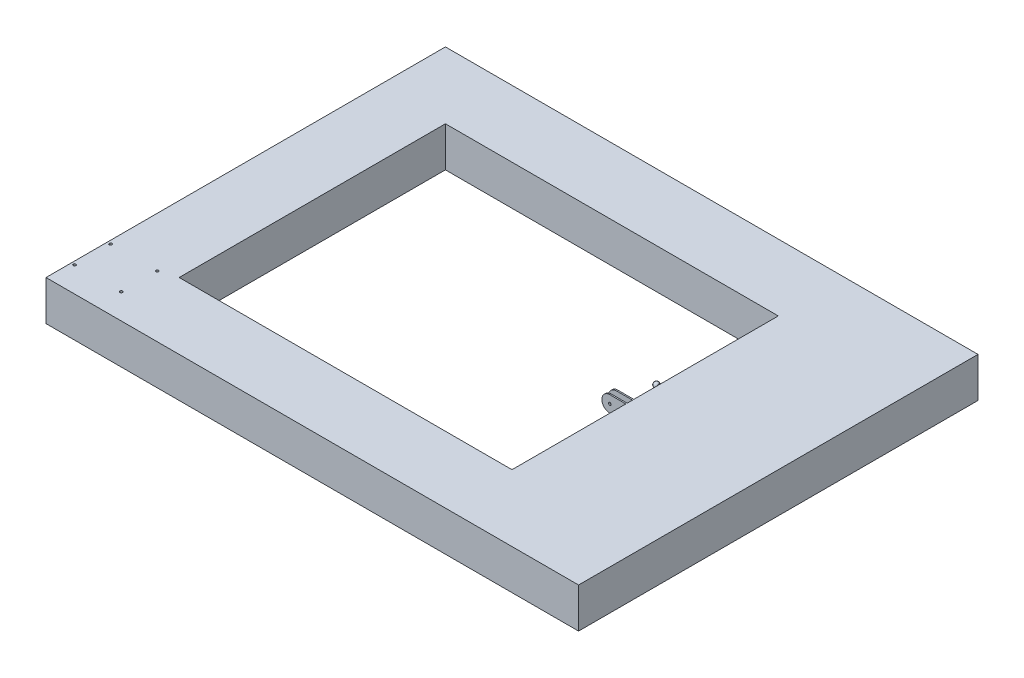
ISO-10303-21;
HEADER;
FILE_DESCRIPTION(('STEP AP214'),'2;1');
FILE_NAME('part.step','',(''),(''),'','','');
FILE_SCHEMA(('AUTOMOTIVE_DESIGN { 1 0 10303 214 1 1 1 1 }'));
ENDSEC;
DATA;
#1=APPLICATION_CONTEXT('core data for automotive mechanical design processes');
#2=APPLICATION_PROTOCOL_DEFINITION('international standard','automotive_design',2000,#1);
#3=PRODUCT_CONTEXT('',#1,'mechanical');
#4=PRODUCT('Part','Part','',(#3));
#5=PRODUCT_RELATED_PRODUCT_CATEGORY('part','',(#4));
#6=PRODUCT_DEFINITION_FORMATION('','',#4);
#7=PRODUCT_DEFINITION_CONTEXT('part definition',#1,'design');
#8=PRODUCT_DEFINITION('design','',#6,#7);
#9=PRODUCT_DEFINITION_SHAPE('','',#8);
#10=(LENGTH_UNIT() NAMED_UNIT(*) SI_UNIT(.MILLI.,.METRE.));
#11=(NAMED_UNIT(*) PLANE_ANGLE_UNIT() SI_UNIT($,.RADIAN.));
#12=(NAMED_UNIT(*) SI_UNIT($,.STERADIAN.) SOLID_ANGLE_UNIT());
#13=UNCERTAINTY_MEASURE_WITH_UNIT(LENGTH_MEASURE(1.E-05),#10,'distance_accuracy_value','');
#14=(GEOMETRIC_REPRESENTATION_CONTEXT(3) GLOBAL_UNCERTAINTY_ASSIGNED_CONTEXT((#13)) GLOBAL_UNIT_ASSIGNED_CONTEXT((#10,
#11,#12)) REPRESENTATION_CONTEXT('',''));
#15=CARTESIAN_POINT('',(0.,0.,0.));
#16=DIRECTION('',(0.,0.,1.));
#17=DIRECTION('',(1.,0.,0.));
#18=AXIS2_PLACEMENT_3D('',#15,#16,#17);
#19=CARTESIAN_POINT('',(0.,0.,3000.));
#20=DIRECTION('',(1.,0.,0.));
#21=DIRECTION('',(0.,0.,-1.));
#22=AXIS2_PLACEMENT_3D('',#19,#20,#21);
#23=PLANE('',#22);
#24=DIRECTION('',(0.,-1.,0.));
#25=VECTOR('',#24,1.);
#26=CARTESIAN_POINT('',(0.,0.,0.));
#27=LINE('',#26,#25);
#28=CARTESIAN_POINT('',(0.,300.,0.));
#29=VERTEX_POINT('',#28);
#30=CARTESIAN_POINT('',(0.,0.,0.));
#31=VERTEX_POINT('',#30);
#32=EDGE_CURVE('E303',#29,#31,#27,.T.);
#33=ORIENTED_EDGE('',*,*,#32,.T.);
#34=DIRECTION('',(0.,0.,-1.));
#35=VECTOR('',#34,1.);
#36=CARTESIAN_POINT('',(0.,0.,3000.));
#37=LINE('',#36,#35);
#38=CARTESIAN_POINT('',(0.,0.,3000.));
#39=VERTEX_POINT('',#38);
#40=EDGE_CURVE('E11',#39,#31,#37,.T.);
#41=ORIENTED_EDGE('',*,*,#40,.F.);
#42=DIRECTION('',(0.,-1.,0.));
#43=VECTOR('',#42,1.);
#44=CARTESIAN_POINT('',(0.,0.,3000.));
#45=LINE('',#44,#43);
#46=CARTESIAN_POINT('',(0.,300.,3000.));
#47=VERTEX_POINT('',#46);
#48=EDGE_CURVE('E323',#47,#39,#45,.T.);
#49=ORIENTED_EDGE('',*,*,#48,.F.);
#50=DIRECTION('',(0.,0.,-1.));
#51=VECTOR('',#50,1.);
#52=CARTESIAN_POINT('',(0.,300.,3000.));
#53=LINE('',#52,#51);
#54=EDGE_CURVE('E306',#47,#29,#53,.T.);
#55=ORIENTED_EDGE('',*,*,#54,.T.);
#56=EDGE_LOOP('',(#33,#41,#49,#55));
#57=FACE_BOUND('',#56,.T.);
#58=ADVANCED_FACE('F40',(#57),#23,.F.);
#59=CARTESIAN_POINT('',(0.,0.,3000.));
#60=DIRECTION('',(0.,1.,0.));
#61=DIRECTION('',(0.,0.,1.));
#62=AXIS2_PLACEMENT_3D('',#59,#60,#61);
#63=PLANE('',#62);
#64=DIRECTION('',(-1.,0.,0.));
#65=VECTOR('',#64,1.);
#66=CARTESIAN_POINT('',(0.,0.,500.));
#67=LINE('',#66,#65);
#68=CARTESIAN_POINT('',(3000.,0.,500.));
#69=VERTEX_POINT('',#68);
#70=CARTESIAN_POINT('',(500.,0.,500.));
#71=VERTEX_POINT('',#70);
#72=EDGE_CURVE('E314',#69,#71,#67,.T.);
#73=ORIENTED_EDGE('',*,*,#72,.T.);
#74=DIRECTION('',(0.,0.,1.));
#75=VECTOR('',#74,1.);
#76=CARTESIAN_POINT('',(500.,0.,3000.));
#77=LINE('',#76,#75);
#78=CARTESIAN_POINT('',(500.,0.,2500.));
#79=VERTEX_POINT('',#78);
#80=EDGE_CURVE('E310',#71,#79,#77,.T.);
#81=ORIENTED_EDGE('',*,*,#80,.T.);
#82=DIRECTION('',(1.,0.,0.));
#83=VECTOR('',#82,1.);
#84=CARTESIAN_POINT('',(0.,0.,2500.));
#85=LINE('',#84,#83);
#86=CARTESIAN_POINT('',(3000.,0.,2500.));
#87=VERTEX_POINT('',#86);
#88=EDGE_CURVE('E259',#79,#87,#85,.T.);
#89=ORIENTED_EDGE('',*,*,#88,.T.);
#90=DIRECTION('',(0.,0.,-1.));
#91=VECTOR('',#90,1.);
#92=CARTESIAN_POINT('',(3000.,0.,3000.));
#93=LINE('',#92,#91);
#94=EDGE_CURVE('E345',#87,#69,#93,.T.);
#95=ORIENTED_EDGE('',*,*,#94,.T.);
#96=EDGE_LOOP('',(#73,#81,#89,#95));
#97=FACE_BOUND('',#96,.T.);
#98=DIRECTION('',(1.,0.,0.));
#99=VECTOR('',#98,1.);
#100=CARTESIAN_POINT('',(0.,0.,0.));
#101=LINE('',#100,#99);
#102=CARTESIAN_POINT('',(4000.,0.,0.));
#103=VERTEX_POINT('',#102);
#104=EDGE_CURVE('E309',#31,#103,#101,.T.);
#105=ORIENTED_EDGE('',*,*,#104,.T.);
#106=DIRECTION('',(0.,0.,-1.));
#107=VECTOR('',#106,1.);
#108=CARTESIAN_POINT('',(4000.,0.,3000.));
#109=LINE('',#108,#107);
#110=CARTESIAN_POINT('',(4000.,0.,3000.));
#111=VERTEX_POINT('',#110);
#112=EDGE_CURVE('E47',#111,#103,#109,.T.);
#113=ORIENTED_EDGE('',*,*,#112,.F.);
#114=DIRECTION('',(1.,0.,0.));
#115=VECTOR('',#114,1.);
#116=CARTESIAN_POINT('',(0.,0.,3000.));
#117=LINE('',#116,#115);
#118=EDGE_CURVE('E339',#39,#111,#117,.T.);
#119=ORIENTED_EDGE('',*,*,#118,.F.);
#120=ORIENTED_EDGE('',*,*,#40,.T.);
#121=EDGE_LOOP('',(#105,#113,#119,#120));
#122=FACE_BOUND('',#121,.T.);
#123=ADVANCED_FACE('F292',(#97,#122),#63,.F.);
#124=CARTESIAN_POINT('',(4000.,0.,3000.));
#125=DIRECTION('',(-1.,0.,0.));
#126=DIRECTION('',(0.,0.,1.));
#127=AXIS2_PLACEMENT_3D('',#124,#125,#126);
#128=PLANE('',#127);
#129=DIRECTION('',(0.,1.,0.));
#130=VECTOR('',#129,1.);
#131=CARTESIAN_POINT('',(4000.,0.,0.));
#132=LINE('',#131,#130);
#133=CARTESIAN_POINT('',(4000.,300.,0.));
#134=VERTEX_POINT('',#133);
#135=EDGE_CURVE('E312',#103,#134,#132,.T.);
#136=ORIENTED_EDGE('',*,*,#135,.T.);
#137=DIRECTION('',(0.,0.,-1.));
#138=VECTOR('',#137,1.);
#139=CARTESIAN_POINT('',(4000.,300.,3000.));
#140=LINE('',#139,#138);
#141=CARTESIAN_POINT('',(4000.,300.,3000.));
#142=VERTEX_POINT('',#141);
#143=EDGE_CURVE('E325',#142,#134,#140,.T.);
#144=ORIENTED_EDGE('',*,*,#143,.F.);
#145=DIRECTION('',(0.,1.,0.));
#146=VECTOR('',#145,1.);
#147=CARTESIAN_POINT('',(4000.,0.,3000.));
#148=LINE('',#147,#146);
#149=EDGE_CURVE('E333',#111,#142,#148,.T.);
#150=ORIENTED_EDGE('',*,*,#149,.F.);
#151=ORIENTED_EDGE('',*,*,#112,.T.);
#152=EDGE_LOOP('',(#136,#144,#150,#151));
#153=FACE_BOUND('',#152,.T.);
#154=ADVANCED_FACE('F297',(#153),#128,.F.);
#155=CARTESIAN_POINT('',(0.,300.,3000.));
#156=DIRECTION('',(0.,-1.,0.));
#157=DIRECTION('',(0.,0.,-1.));
#158=AXIS2_PLACEMENT_3D('',#155,#156,#157);
#159=PLANE('',#158);
#160=CARTESIAN_POINT('',(375.,300.,2540.));
#161=DIRECTION('',(0.,1.,0.));
#162=DIRECTION('',(0.,0.,1.));
#163=AXIS2_PLACEMENT_3D('',#160,#161,#162);
#164=CIRCLE('',#163,9.99999999999998);
#165=CARTESIAN_POINT('',(375.,300.,2550.));
#166=VERTEX_POINT('',#165);
#167=EDGE_CURVE('E628',#166,#166,#164,.T.);
#168=ORIENTED_EDGE('',*,*,#167,.F.);
#169=EDGE_LOOP('',(#168));
#170=FACE_BOUND('',#169,.T.);
#171=CARTESIAN_POINT('',(24.9999999999999,300.,2810.));
#172=DIRECTION('',(0.,1.,0.));
#173=DIRECTION('',(0.,0.,1.));
#174=AXIS2_PLACEMENT_3D('',#171,#172,#173);
#175=CIRCLE('',#174,10.);
#176=CARTESIAN_POINT('',(24.9999999999999,300.,2820.));
#177=VERTEX_POINT('',#176);
#178=EDGE_CURVE('E615',#177,#177,#175,.T.);
#179=ORIENTED_EDGE('',*,*,#178,.F.);
#180=EDGE_LOOP('',(#179));
#181=FACE_BOUND('',#180,.T.);
#182=CARTESIAN_POINT('',(375.,300.,2810.));
#183=DIRECTION('',(0.,1.,0.));
#184=DIRECTION('',(0.,0.,1.));
#185=AXIS2_PLACEMENT_3D('',#182,#183,#184);
#186=CIRCLE('',#185,9.99999999999998);
#187=CARTESIAN_POINT('',(375.,300.,2820.));
#188=VERTEX_POINT('',#187);
#189=EDGE_CURVE('E616',#188,#188,#186,.T.);
#190=ORIENTED_EDGE('',*,*,#189,.F.);
#191=EDGE_LOOP('',(#190));
#192=FACE_BOUND('',#191,.T.);
#193=CARTESIAN_POINT('',(24.9999999999999,300.,2540.));
#194=DIRECTION('',(0.,1.,0.));
#195=DIRECTION('',(0.,0.,1.));
#196=AXIS2_PLACEMENT_3D('',#193,#194,#195);
#197=CIRCLE('',#196,10.);
#198=CARTESIAN_POINT('',(24.9999999999999,300.,2550.));
#199=VERTEX_POINT('',#198);
#200=EDGE_CURVE('E627',#199,#199,#197,.T.);
#201=ORIENTED_EDGE('',*,*,#200,.F.);
#202=EDGE_LOOP('',(#201));
#203=FACE_BOUND('',#202,.T.);
#204=DIRECTION('',(1.,0.,0.));
#205=VECTOR('',#204,1.);
#206=CARTESIAN_POINT('',(500.,300.,2500.));
#207=LINE('',#206,#205);
#208=CARTESIAN_POINT('',(500.,300.,2500.));
#209=VERTEX_POINT('',#208);
#210=CARTESIAN_POINT('',(3000.,300.,2500.));
#211=VERTEX_POINT('',#210);
#212=EDGE_CURVE('E171',#209,#211,#207,.T.);
#213=ORIENTED_EDGE('',*,*,#212,.F.);
#214=DIRECTION('',(0.,0.,1.));
#215=VECTOR('',#214,1.);
#216=CARTESIAN_POINT('',(500.,300.,500.));
#217=LINE('',#216,#215);
#218=CARTESIAN_POINT('',(500.,300.,500.));
#219=VERTEX_POINT('',#218);
#220=EDGE_CURVE('E174',#219,#209,#217,.T.);
#221=ORIENTED_EDGE('',*,*,#220,.F.);
#222=DIRECTION('',(-1.,0.,0.));
#223=VECTOR('',#222,1.);
#224=CARTESIAN_POINT('',(500.,300.,500.));
#225=LINE('',#224,#223);
#226=CARTESIAN_POINT('',(3000.,300.,500.));
#227=VERTEX_POINT('',#226);
#228=EDGE_CURVE('E168',#227,#219,#225,.T.);
#229=ORIENTED_EDGE('',*,*,#228,.F.);
#230=DIRECTION('',(0.,0.,-1.));
#231=VECTOR('',#230,1.);
#232=CARTESIAN_POINT('',(3000.,300.,500.));
#233=LINE('',#232,#231);
#234=CARTESIAN_POINT('',(3000.,300.,1385.));
#235=VERTEX_POINT('',#234);
#236=EDGE_CURVE('E160',#235,#227,#233,.T.);
#237=ORIENTED_EDGE('',*,*,#236,.F.);
#238=CARTESIAN_POINT('',(3000.,300.,1585.));
#239=VERTEX_POINT('',#238);
#240=EDGE_CURVE('E151',#239,#235,#233,.T.);
#241=ORIENTED_EDGE('',*,*,#240,.F.);
#242=DIRECTION('',(1.,0.,0.));
#243=VECTOR('',#242,1.);
#244=CARTESIAN_POINT('',(2880.,300.,1585.));
#245=LINE('',#244,#243);
#246=CARTESIAN_POINT('',(2880.,300.,1585.));
#247=VERTEX_POINT('',#246);
#248=EDGE_CURVE('E212',#247,#239,#245,.T.);
#249=ORIENTED_EDGE('',*,*,#248,.F.);
#250=DIRECTION('',(0.,0.,1.));
#251=VECTOR('',#250,1.);
#252=CARTESIAN_POINT('',(2880.,300.,1585.));
#253=LINE('',#252,#251);
#254=CARTESIAN_POINT('',(2880.,300.,1595.));
#255=VERTEX_POINT('',#254);
#256=EDGE_CURVE('E199',#247,#255,#253,.T.);
#257=ORIENTED_EDGE('',*,*,#256,.T.);
#258=DIRECTION('',(1.,0.,0.));
#259=VECTOR('',#258,1.);
#260=CARTESIAN_POINT('',(2880.,300.,1595.));
#261=LINE('',#260,#259);
#262=CARTESIAN_POINT('',(3000.,300.,1595.));
#263=VERTEX_POINT('',#262);
#264=EDGE_CURVE('E194',#255,#263,#261,.T.);
#265=ORIENTED_EDGE('',*,*,#264,.T.);
#266=CARTESIAN_POINT('',(3000.,300.,1635.));
#267=VERTEX_POINT('',#266);
#268=EDGE_CURVE('E159',#267,#263,#233,.T.);
#269=ORIENTED_EDGE('',*,*,#268,.F.);
#270=DIRECTION('',(1.,0.,0.));
#271=VECTOR('',#270,1.);
#272=CARTESIAN_POINT('',(2880.,300.,1635.));
#273=LINE('',#272,#271);
#274=CARTESIAN_POINT('',(2880.,300.,1635.));
#275=VERTEX_POINT('',#274);
#276=EDGE_CURVE('E225',#275,#267,#273,.T.);
#277=ORIENTED_EDGE('',*,*,#276,.F.);
#278=DIRECTION('',(0.,0.,1.));
#279=VECTOR('',#278,1.);
#280=CARTESIAN_POINT('',(2880.,300.,1635.));
#281=LINE('',#280,#279);
#282=CARTESIAN_POINT('',(2880.,300.,1645.));
#283=VERTEX_POINT('',#282);
#284=EDGE_CURVE('E233',#275,#283,#281,.T.);
#285=ORIENTED_EDGE('',*,*,#284,.T.);
#286=DIRECTION('',(1.,0.,0.));
#287=VECTOR('',#286,1.);
#288=CARTESIAN_POINT('',(2880.,300.,1645.));
#289=LINE('',#288,#287);
#290=CARTESIAN_POINT('',(3000.,300.,1645.));
#291=VERTEX_POINT('',#290);
#292=EDGE_CURVE('E222',#283,#291,#289,.T.);
#293=ORIENTED_EDGE('',*,*,#292,.T.);
#294=EDGE_CURVE('E172',#211,#291,#233,.T.);
#295=ORIENTED_EDGE('',*,*,#294,.F.);
#296=EDGE_LOOP('',(#213,#221,#229,#237,#241,#249,#257,#265,#269,#277,#285,#293,#295));
#297=FACE_BOUND('',#296,.T.);
#298=DIRECTION('',(-1.,0.,0.));
#299=VECTOR('',#298,1.);
#300=CARTESIAN_POINT('',(0.,300.,0.));
#301=LINE('',#300,#299);
#302=EDGE_CURVE('E321',#134,#29,#301,.T.);
#303=ORIENTED_EDGE('',*,*,#302,.T.);
#304=ORIENTED_EDGE('',*,*,#54,.F.);
#305=DIRECTION('',(-1.,0.,0.));
#306=VECTOR('',#305,1.);
#307=CARTESIAN_POINT('',(0.,300.,3000.));
#308=LINE('',#307,#306);
#309=EDGE_CURVE('E317',#142,#47,#308,.T.);
#310=ORIENTED_EDGE('',*,*,#309,.F.);
#311=ORIENTED_EDGE('',*,*,#143,.T.);
#312=EDGE_LOOP('',(#303,#304,#310,#311));
#313=FACE_BOUND('',#312,.T.);
#314=ADVANCED_FACE('F164',(#170,#181,#192,#203,#297,#313),#159,.F.);
#315=CARTESIAN_POINT('',(0.,0.,3000.));
#316=DIRECTION('',(0.,0.,-1.));
#317=DIRECTION('',(-1.,0.,0.));
#318=AXIS2_PLACEMENT_3D('',#315,#316,#317);
#319=PLANE('',#318);
#320=ORIENTED_EDGE('',*,*,#48,.T.);
#321=ORIENTED_EDGE('',*,*,#118,.T.);
#322=ORIENTED_EDGE('',*,*,#149,.T.);
#323=ORIENTED_EDGE('',*,*,#309,.T.);
#324=EDGE_LOOP('',(#320,#321,#322,#323));
#325=FACE_BOUND('',#324,.T.);
#326=ADVANCED_FACE('F355',(#325),#319,.F.);
#327=CARTESIAN_POINT('',(0.,0.,0.));
#328=DIRECTION('',(0.,0.,-1.));
#329=DIRECTION('',(-1.,0.,0.));
#330=AXIS2_PLACEMENT_3D('',#327,#328,#329);
#331=PLANE('',#330);
#332=ORIENTED_EDGE('',*,*,#32,.F.);
#333=ORIENTED_EDGE('',*,*,#302,.F.);
#334=ORIENTED_EDGE('',*,*,#135,.F.);
#335=ORIENTED_EDGE('',*,*,#104,.F.);
#336=EDGE_LOOP('',(#332,#333,#334,#335));
#337=FACE_BOUND('',#336,.T.);
#338=ADVANCED_FACE('F335',(#337),#331,.T.);
#339=CARTESIAN_POINT('',(500.,-2700.,500.));
#340=DIRECTION('',(-1.,0.,0.));
#341=DIRECTION('',(0.,0.,1.));
#342=AXIS2_PLACEMENT_3D('',#339,#340,#341);
#343=PLANE('',#342);
#344=DIRECTION('',(0.,1.,0.));
#345=VECTOR('',#344,1.);
#346=CARTESIAN_POINT('',(500.,-2700.,500.));
#347=LINE('',#346,#345);
#348=EDGE_CURVE('E255',#71,#219,#347,.T.);
#349=ORIENTED_EDGE('',*,*,#348,.T.);
#350=ORIENTED_EDGE('',*,*,#220,.T.);
#351=DIRECTION('',(0.,1.,0.));
#352=VECTOR('',#351,1.);
#353=CARTESIAN_POINT('',(500.,-2700.,2500.));
#354=LINE('',#353,#352);
#355=EDGE_CURVE('E179',#79,#209,#354,.T.);
#356=ORIENTED_EDGE('',*,*,#355,.F.);
#357=ORIENTED_EDGE('',*,*,#80,.F.);
#358=EDGE_LOOP('',(#349,#350,#356,#357));
#359=FACE_BOUND('',#358,.T.);
#360=ADVANCED_FACE('F252',(#359),#343,.F.);
#361=CARTESIAN_POINT('',(500.,-2700.,500.));
#362=DIRECTION('',(0.,0.,-1.));
#363=DIRECTION('',(-1.,0.,0.));
#364=AXIS2_PLACEMENT_3D('',#361,#362,#363);
#365=PLANE('',#364);
#366=DIRECTION('',(0.,1.,0.));
#367=VECTOR('',#366,1.);
#368=CARTESIAN_POINT('',(3000.,-2700.,500.));
#369=LINE('',#368,#367);
#370=EDGE_CURVE('E350',#69,#227,#369,.T.);
#371=ORIENTED_EDGE('',*,*,#370,.T.);
#372=ORIENTED_EDGE('',*,*,#228,.T.);
#373=ORIENTED_EDGE('',*,*,#348,.F.);
#374=ORIENTED_EDGE('',*,*,#72,.F.);
#375=EDGE_LOOP('',(#371,#372,#373,#374));
#376=FACE_BOUND('',#375,.T.);
#377=ADVANCED_FACE('F353',(#376),#365,.F.);
#378=CARTESIAN_POINT('',(3000.,-2700.,500.));
#379=DIRECTION('',(1.,0.,0.));
#380=DIRECTION('',(0.,0.,-1.));
#381=AXIS2_PLACEMENT_3D('',#378,#379,#380);
#382=PLANE('',#381);
#383=ORIENTED_EDGE('',*,*,#240,.T.);
#384=CARTESIAN_POINT('',(3000.,280.,1385.));
#385=DIRECTION('',(1.,0.,0.));
#386=DIRECTION('',(0.,0.,-1.));
#387=AXIS2_PLACEMENT_3D('',#384,#385,#386);
#388=CIRCLE('',#387,20.);
#389=EDGE_CURVE('E155',#235,#235,#388,.T.);
#390=ORIENTED_EDGE('',*,*,#389,.T.);
#391=ORIENTED_EDGE('',*,*,#236,.T.);
#392=ORIENTED_EDGE('',*,*,#370,.F.);
#393=ORIENTED_EDGE('',*,*,#94,.F.);
#394=DIRECTION('',(0.,1.,0.));
#395=VECTOR('',#394,1.);
#396=CARTESIAN_POINT('',(3000.,-2700.,2500.));
#397=LINE('',#396,#395);
#398=EDGE_CURVE('E260',#87,#211,#397,.T.);
#399=ORIENTED_EDGE('',*,*,#398,.T.);
#400=ORIENTED_EDGE('',*,*,#294,.T.);
#401=DIRECTION('',(0.,-1.,0.));
#402=VECTOR('',#401,1.);
#403=CARTESIAN_POINT('',(3000.,300.,1645.));
#404=LINE('',#403,#402);
#405=CARTESIAN_POINT('',(3000.,180.,1645.));
#406=VERTEX_POINT('',#405);
#407=EDGE_CURVE('E236',#291,#406,#404,.T.);
#408=ORIENTED_EDGE('',*,*,#407,.T.);
#409=DIRECTION('',(0.,0.,1.));
#410=VECTOR('',#409,1.);
#411=CARTESIAN_POINT('',(3000.,180.,1635.));
#412=LINE('',#411,#410);
#413=CARTESIAN_POINT('',(3000.,180.,1635.));
#414=VERTEX_POINT('',#413);
#415=EDGE_CURVE('E246',#414,#406,#412,.T.);
#416=ORIENTED_EDGE('',*,*,#415,.F.);
#417=DIRECTION('',(0.,-1.,0.));
#418=VECTOR('',#417,1.);
#419=CARTESIAN_POINT('',(3000.,300.,1635.));
#420=LINE('',#419,#418);
#421=EDGE_CURVE('E184',#267,#414,#420,.T.);
#422=ORIENTED_EDGE('',*,*,#421,.F.);
#423=ORIENTED_EDGE('',*,*,#268,.T.);
#424=DIRECTION('',(0.,-1.,0.));
#425=VECTOR('',#424,1.);
#426=CARTESIAN_POINT('',(3000.,300.,1595.));
#427=LINE('',#426,#425);
#428=CARTESIAN_POINT('',(3000.,180.,1595.));
#429=VERTEX_POINT('',#428);
#430=EDGE_CURVE('E182',#263,#429,#427,.T.);
#431=ORIENTED_EDGE('',*,*,#430,.T.);
#432=DIRECTION('',(0.,0.,1.));
#433=VECTOR('',#432,1.);
#434=CARTESIAN_POINT('',(3000.,180.,1585.));
#435=LINE('',#434,#433);
#436=CARTESIAN_POINT('',(3000.,180.,1585.));
#437=VERTEX_POINT('',#436);
#438=EDGE_CURVE('E54',#437,#429,#435,.T.);
#439=ORIENTED_EDGE('',*,*,#438,.F.);
#440=DIRECTION('',(0.,-1.,0.));
#441=VECTOR('',#440,1.);
#442=CARTESIAN_POINT('',(3000.,300.,1585.));
#443=LINE('',#442,#441);
#444=EDGE_CURVE('E58',#239,#437,#443,.T.);
#445=ORIENTED_EDGE('',*,*,#444,.F.);
#446=EDGE_LOOP('',(#383,#390,#391,#392,#393,#399,#400,#408,#416,#422,#423,#431,#439,#445));
#447=FACE_BOUND('',#446,.T.);
#448=ADVANCED_FACE('F153',(#447),#382,.F.);
#449=CARTESIAN_POINT('',(500.,-2700.,2500.));
#450=DIRECTION('',(0.,0.,1.));
#451=DIRECTION('',(1.,0.,0.));
#452=AXIS2_PLACEMENT_3D('',#449,#450,#451);
#453=PLANE('',#452);
#454=ORIENTED_EDGE('',*,*,#355,.T.);
#455=ORIENTED_EDGE('',*,*,#212,.T.);
#456=ORIENTED_EDGE('',*,*,#398,.F.);
#457=ORIENTED_EDGE('',*,*,#88,.F.);
#458=EDGE_LOOP('',(#454,#455,#456,#457));
#459=FACE_BOUND('',#458,.T.);
#460=ADVANCED_FACE('F257',(#459),#453,.F.);
#461=CARTESIAN_POINT('',(2880.,240.,1635.));
#462=DIRECTION('',(0.,0.,-1.));
#463=DIRECTION('',(-1.,0.,0.));
#464=AXIS2_PLACEMENT_3D('',#461,#462,#463);
#465=PLANE('',#464);
#466=ORIENTED_EDGE('',*,*,#276,.T.);
#467=ORIENTED_EDGE('',*,*,#421,.T.);
#468=DIRECTION('',(-1.,0.,0.));
#469=VECTOR('',#468,1.);
#470=CARTESIAN_POINT('',(3000.,180.,1635.));
#471=LINE('',#470,#469);
#472=CARTESIAN_POINT('',(2880.,180.,1635.));
#473=VERTEX_POINT('',#472);
#474=EDGE_CURVE('E229',#414,#473,#471,.T.);
#475=ORIENTED_EDGE('',*,*,#474,.T.);
#476=CARTESIAN_POINT('',(2880.,240.,1635.));
#477=DIRECTION('',(0.,0.,-1.));
#478=DIRECTION('',(-1.,0.,0.));
#479=AXIS2_PLACEMENT_3D('',#476,#477,#478);
#480=CIRCLE('',#479,60.);
#481=EDGE_CURVE('E231',#473,#275,#480,.T.);
#482=ORIENTED_EDGE('',*,*,#481,.T.);
#483=EDGE_LOOP('',(#466,#467,#475,#482));
#484=FACE_BOUND('',#483,.T.);
#485=CARTESIAN_POINT('',(2880.,240.,1635.));
#486=DIRECTION('',(0.,0.,-1.));
#487=DIRECTION('',(-1.,0.,0.));
#488=AXIS2_PLACEMENT_3D('',#485,#486,#487);
#489=CIRCLE('',#488,9.99999999999964);
#490=CARTESIAN_POINT('',(2870.,240.,1635.));
#491=VERTEX_POINT('',#490);
#492=EDGE_CURVE('E219',#491,#491,#489,.T.);
#493=ORIENTED_EDGE('',*,*,#492,.F.);
#494=EDGE_LOOP('',(#493));
#495=FACE_BOUND('',#494,.T.);
#496=ADVANCED_FACE('F275',(#484,#495),#465,.T.);
#497=CARTESIAN_POINT('',(2880.,240.,1645.));
#498=DIRECTION('',(0.,0.,-1.));
#499=DIRECTION('',(-1.,0.,0.));
#500=AXIS2_PLACEMENT_3D('',#497,#498,#499);
#501=PLANE('',#500);
#502=ORIENTED_EDGE('',*,*,#292,.F.);
#503=CARTESIAN_POINT('',(2880.,240.,1645.));
#504=DIRECTION('',(0.,0.,-1.));
#505=DIRECTION('',(-1.,0.,0.));
#506=AXIS2_PLACEMENT_3D('',#503,#504,#505);
#507=CIRCLE('',#506,60.);
#508=CARTESIAN_POINT('',(2880.,180.,1645.));
#509=VERTEX_POINT('',#508);
#510=EDGE_CURVE('E227',#509,#283,#507,.T.);
#511=ORIENTED_EDGE('',*,*,#510,.F.);
#512=DIRECTION('',(-1.,0.,0.));
#513=VECTOR('',#512,1.);
#514=CARTESIAN_POINT('',(3000.,180.,1645.));
#515=LINE('',#514,#513);
#516=EDGE_CURVE('E238',#406,#509,#515,.T.);
#517=ORIENTED_EDGE('',*,*,#516,.F.);
#518=ORIENTED_EDGE('',*,*,#407,.F.);
#519=EDGE_LOOP('',(#502,#511,#517,#518));
#520=FACE_BOUND('',#519,.T.);
#521=CARTESIAN_POINT('',(2880.,240.,1645.));
#522=DIRECTION('',(0.,0.,-1.));
#523=DIRECTION('',(-1.,0.,0.));
#524=AXIS2_PLACEMENT_3D('',#521,#522,#523);
#525=CIRCLE('',#524,9.99999999999964);
#526=CARTESIAN_POINT('',(2870.,240.,1645.));
#527=VERTEX_POINT('',#526);
#528=EDGE_CURVE('E218',#527,#527,#525,.T.);
#529=ORIENTED_EDGE('',*,*,#528,.T.);
#530=EDGE_LOOP('',(#529));
#531=FACE_BOUND('',#530,.T.);
#532=ADVANCED_FACE('F266',(#520,#531),#501,.F.);
#533=CARTESIAN_POINT('',(3000.,180.,1635.));
#534=DIRECTION('',(0.,1.,0.));
#535=DIRECTION('',(0.,0.,1.));
#536=AXIS2_PLACEMENT_3D('',#533,#534,#535);
#537=PLANE('',#536);
#538=ORIENTED_EDGE('',*,*,#516,.T.);
#539=DIRECTION('',(0.,0.,1.));
#540=VECTOR('',#539,1.);
#541=CARTESIAN_POINT('',(2880.,180.,1635.));
#542=LINE('',#541,#540);
#543=EDGE_CURVE('E243',#473,#509,#542,.T.);
#544=ORIENTED_EDGE('',*,*,#543,.F.);
#545=ORIENTED_EDGE('',*,*,#474,.F.);
#546=ORIENTED_EDGE('',*,*,#415,.T.);
#547=EDGE_LOOP('',(#538,#544,#545,#546));
#548=FACE_BOUND('',#547,.T.);
#549=ADVANCED_FACE('F271',(#548),#537,.F.);
#550=CARTESIAN_POINT('',(2880.,240.,1635.));
#551=DIRECTION('',(0.,0.,1.));
#552=DIRECTION('',(1.,0.,0.));
#553=AXIS2_PLACEMENT_3D('',#550,#551,#552);
#554=CYLINDRICAL_SURFACE('',#553,60.);
#555=ORIENTED_EDGE('',*,*,#510,.T.);
#556=ORIENTED_EDGE('',*,*,#284,.F.);
#557=ORIENTED_EDGE('',*,*,#481,.F.);
#558=ORIENTED_EDGE('',*,*,#543,.T.);
#559=EDGE_LOOP('',(#555,#556,#557,#558));
#560=FACE_BOUND('',#559,.T.);
#561=ADVANCED_FACE('F278',(#560),#554,.T.);
#562=CARTESIAN_POINT('',(2880.,240.,1635.));
#563=DIRECTION('',(0.,0.,1.));
#564=DIRECTION('',(1.,0.,0.));
#565=AXIS2_PLACEMENT_3D('',#562,#563,#564);
#566=CYLINDRICAL_SURFACE('',#565,9.99999999999964);
#567=ORIENTED_EDGE('',*,*,#492,.T.);
#568=EDGE_LOOP('',(#567));
#569=FACE_BOUND('',#568,.T.);
#570=ORIENTED_EDGE('',*,*,#528,.F.);
#571=EDGE_LOOP('',(#570));
#572=FACE_BOUND('',#571,.T.);
#573=ADVANCED_FACE('F280',(#569,#572),#566,.F.);
#574=CARTESIAN_POINT('',(2880.,240.,1585.));
#575=DIRECTION('',(0.,0.,-1.));
#576=DIRECTION('',(-1.,0.,0.));
#577=AXIS2_PLACEMENT_3D('',#574,#575,#576);
#578=PLANE('',#577);
#579=ORIENTED_EDGE('',*,*,#248,.T.);
#580=ORIENTED_EDGE('',*,*,#444,.T.);
#581=DIRECTION('',(-1.,0.,0.));
#582=VECTOR('',#581,1.);
#583=CARTESIAN_POINT('',(3000.,180.,1585.));
#584=LINE('',#583,#582);
#585=CARTESIAN_POINT('',(2880.,180.,1585.));
#586=VERTEX_POINT('',#585);
#587=EDGE_CURVE('E645',#437,#586,#584,.T.);
#588=ORIENTED_EDGE('',*,*,#587,.T.);
#589=CARTESIAN_POINT('',(2880.,240.,1585.));
#590=DIRECTION('',(0.,0.,-1.));
#591=DIRECTION('',(-1.,0.,0.));
#592=AXIS2_PLACEMENT_3D('',#589,#590,#591);
#593=CIRCLE('',#592,60.);
#594=EDGE_CURVE('E206',#586,#247,#593,.T.);
#595=ORIENTED_EDGE('',*,*,#594,.T.);
#596=EDGE_LOOP('',(#579,#580,#588,#595));
#597=FACE_BOUND('',#596,.T.);
#598=CARTESIAN_POINT('',(2880.,240.,1585.));
#599=DIRECTION('',(0.,0.,-1.));
#600=DIRECTION('',(-1.,0.,0.));
#601=AXIS2_PLACEMENT_3D('',#598,#599,#600);
#602=CIRCLE('',#601,9.99999999999964);
#603=CARTESIAN_POINT('',(2870.,240.,1585.));
#604=VERTEX_POINT('',#603);
#605=EDGE_CURVE('E200',#604,#604,#602,.T.);
#606=ORIENTED_EDGE('',*,*,#605,.F.);
#607=EDGE_LOOP('',(#606));
#608=FACE_BOUND('',#607,.T.);
#609=ADVANCED_FACE('F286',(#597,#608),#578,.T.);
#610=CARTESIAN_POINT('',(2880.,240.,1595.));
#611=DIRECTION('',(0.,0.,-1.));
#612=DIRECTION('',(-1.,0.,0.));
#613=AXIS2_PLACEMENT_3D('',#610,#611,#612);
#614=PLANE('',#613);
#615=ORIENTED_EDGE('',*,*,#264,.F.);
#616=CARTESIAN_POINT('',(2880.,240.,1595.));
#617=DIRECTION('',(0.,0.,-1.));
#618=DIRECTION('',(-1.,0.,0.));
#619=AXIS2_PLACEMENT_3D('',#616,#617,#618);
#620=CIRCLE('',#619,60.);
#621=CARTESIAN_POINT('',(2880.,180.,1595.));
#622=VERTEX_POINT('',#621);
#623=EDGE_CURVE('E210',#622,#255,#620,.T.);
#624=ORIENTED_EDGE('',*,*,#623,.F.);
#625=DIRECTION('',(-1.,0.,0.));
#626=VECTOR('',#625,1.);
#627=CARTESIAN_POINT('',(3000.,180.,1595.));
#628=LINE('',#627,#626);
#629=EDGE_CURVE('E195',#429,#622,#628,.T.);
#630=ORIENTED_EDGE('',*,*,#629,.F.);
#631=ORIENTED_EDGE('',*,*,#430,.F.);
#632=EDGE_LOOP('',(#615,#624,#630,#631));
#633=FACE_BOUND('',#632,.T.);
#634=CARTESIAN_POINT('',(2880.,240.,1595.));
#635=DIRECTION('',(0.,0.,-1.));
#636=DIRECTION('',(-1.,0.,0.));
#637=AXIS2_PLACEMENT_3D('',#634,#635,#636);
#638=CIRCLE('',#637,9.99999999999964);
#639=CARTESIAN_POINT('',(2870.,240.,1595.));
#640=VERTEX_POINT('',#639);
#641=EDGE_CURVE('E203',#640,#640,#638,.T.);
#642=ORIENTED_EDGE('',*,*,#641,.T.);
#643=EDGE_LOOP('',(#642));
#644=FACE_BOUND('',#643,.T.);
#645=ADVANCED_FACE('F191',(#633,#644),#614,.F.);
#646=CARTESIAN_POINT('',(3000.,180.,1585.));
#647=DIRECTION('',(0.,1.,0.));
#648=DIRECTION('',(0.,0.,1.));
#649=AXIS2_PLACEMENT_3D('',#646,#647,#648);
#650=PLANE('',#649);
#651=ORIENTED_EDGE('',*,*,#629,.T.);
#652=DIRECTION('',(0.,0.,1.));
#653=VECTOR('',#652,1.);
#654=CARTESIAN_POINT('',(2880.,180.,1585.));
#655=LINE('',#654,#653);
#656=EDGE_CURVE('E214',#586,#622,#655,.T.);
#657=ORIENTED_EDGE('',*,*,#656,.F.);
#658=ORIENTED_EDGE('',*,*,#587,.F.);
#659=ORIENTED_EDGE('',*,*,#438,.T.);
#660=EDGE_LOOP('',(#651,#657,#658,#659));
#661=FACE_BOUND('',#660,.T.);
#662=ADVANCED_FACE('F502',(#661),#650,.F.);
#663=CARTESIAN_POINT('',(2880.,240.,1585.));
#664=DIRECTION('',(0.,0.,1.));
#665=DIRECTION('',(1.,0.,0.));
#666=AXIS2_PLACEMENT_3D('',#663,#664,#665);
#667=CYLINDRICAL_SURFACE('',#666,60.);
#668=ORIENTED_EDGE('',*,*,#623,.T.);
#669=ORIENTED_EDGE('',*,*,#256,.F.);
#670=ORIENTED_EDGE('',*,*,#594,.F.);
#671=ORIENTED_EDGE('',*,*,#656,.T.);
#672=EDGE_LOOP('',(#668,#669,#670,#671));
#673=FACE_BOUND('',#672,.T.);
#674=ADVANCED_FACE('F492',(#673),#667,.T.);
#675=CARTESIAN_POINT('',(2880.,240.,1585.));
#676=DIRECTION('',(0.,0.,1.));
#677=DIRECTION('',(1.,0.,0.));
#678=AXIS2_PLACEMENT_3D('',#675,#676,#677);
#679=CYLINDRICAL_SURFACE('',#678,9.99999999999964);
#680=ORIENTED_EDGE('',*,*,#605,.T.);
#681=EDGE_LOOP('',(#680));
#682=FACE_BOUND('',#681,.T.);
#683=ORIENTED_EDGE('',*,*,#641,.F.);
#684=EDGE_LOOP('',(#683));
#685=FACE_BOUND('',#684,.T.);
#686=ADVANCED_FACE('F470',(#682,#685),#679,.F.);
#687=CARTESIAN_POINT('',(2986.04327559136,280.,1385.));
#688=DIRECTION('',(1.,0.,0.));
#689=DIRECTION('',(0.,0.,-1.));
#690=AXIS2_PLACEMENT_3D('',#687,#688,#689);
#691=CONICAL_SURFACE('',#690,11.9420814056677,0.523598775598304);
#692=ORIENTED_EDGE('',*,*,#389,.F.);
#693=EDGE_LOOP('',(#692));
#694=FACE_BOUND('',#693,.T.);
#695=CARTESIAN_POINT('',(2986.04327559136,280.,1385.));
#696=DIRECTION('',(1.,0.,0.));
#697=DIRECTION('',(0.,0.,-1.));
#698=AXIS2_PLACEMENT_3D('',#695,#696,#697);
#699=CIRCLE('',#698,11.9420814056677);
#700=CARTESIAN_POINT('',(2986.04327559136,280.,1373.05791859433));
#701=VERTEX_POINT('',#700);
#702=EDGE_CURVE('E636',#701,#701,#699,.T.);
#703=ORIENTED_EDGE('',*,*,#702,.T.);
#704=EDGE_LOOP('',(#703));
#705=FACE_BOUND('',#704,.T.);
#706=ADVANCED_FACE('F462',(#694,#705),#691,.T.);
#707=CARTESIAN_POINT('',(2970.,280.,1385.));
#708=DIRECTION('',(1.,0.,0.));
#709=DIRECTION('',(0.,1.,0.));
#710=AXIS2_PLACEMENT_3D('',#707,#708,#709);
#711=SPHERICAL_SURFACE('',#710,20.);
#712=ORIENTED_EDGE('',*,*,#702,.F.);
#713=EDGE_LOOP('',(#712));
#714=FACE_BOUND('',#713,.T.);
#715=ADVANCED_FACE('F429',(#714),#711,.T.);
#716=CARTESIAN_POINT('',(24.9999999999999,230.,2540.));
#717=DIRECTION('',(0.,1.,0.));
#718=DIRECTION('',(0.,0.,1.));
#719=AXIS2_PLACEMENT_3D('',#716,#717,#718);
#720=CYLINDRICAL_SURFACE('',#719,10.);
#721=CARTESIAN_POINT('',(24.9999999999999,230.,2540.));
#722=DIRECTION('',(0.,1.,0.));
#723=DIRECTION('',(0.,0.,1.));
#724=AXIS2_PLACEMENT_3D('',#721,#722,#723);
#725=CIRCLE('',#724,10.);
#726=CARTESIAN_POINT('',(24.9999999999999,230.,2550.));
#727=VERTEX_POINT('',#726);
#728=EDGE_CURVE('E633',#727,#727,#725,.T.);
#729=ORIENTED_EDGE('',*,*,#728,.F.);
#730=EDGE_LOOP('',(#729));
#731=FACE_BOUND('',#730,.T.);
#732=ORIENTED_EDGE('',*,*,#200,.T.);
#733=EDGE_LOOP('',(#732));
#734=FACE_BOUND('',#733,.T.);
#735=ADVANCED_FACE('F425',(#731,#734),#720,.F.);
#736=CARTESIAN_POINT('',(24.9999999999999,230.,2540.));
#737=DIRECTION('',(0.,1.,0.));
#738=DIRECTION('',(0.,0.,1.));
#739=AXIS2_PLACEMENT_3D('',#736,#737,#738);
#740=PLANE('',#739);
#741=ORIENTED_EDGE('',*,*,#728,.T.);
#742=EDGE_LOOP('',(#741));
#743=FACE_BOUND('',#742,.T.);
#744=ADVANCED_FACE('F389',(#743),#740,.T.);
#745=CARTESIAN_POINT('',(375.,230.,2810.));
#746=DIRECTION('',(0.,1.,0.));
#747=DIRECTION('',(0.,0.,1.));
#748=AXIS2_PLACEMENT_3D('',#745,#746,#747);
#749=CYLINDRICAL_SURFACE('',#748,9.99999999999998);
#750=CARTESIAN_POINT('',(375.,230.,2810.));
#751=DIRECTION('',(0.,1.,0.));
#752=DIRECTION('',(0.,0.,1.));
#753=AXIS2_PLACEMENT_3D('',#750,#751,#752);
#754=CIRCLE('',#753,9.99999999999998);
#755=CARTESIAN_POINT('',(375.,230.,2820.));
#756=VERTEX_POINT('',#755);
#757=EDGE_CURVE('E614',#756,#756,#754,.T.);
#758=ORIENTED_EDGE('',*,*,#757,.F.);
#759=EDGE_LOOP('',(#758));
#760=FACE_BOUND('',#759,.T.);
#761=ORIENTED_EDGE('',*,*,#189,.T.);
#762=EDGE_LOOP('',(#761));
#763=FACE_BOUND('',#762,.T.);
#764=ADVANCED_FACE('F383',(#760,#763),#749,.F.);
#765=CARTESIAN_POINT('',(375.,230.,2810.));
#766=DIRECTION('',(0.,1.,0.));
#767=DIRECTION('',(0.,0.,1.));
#768=AXIS2_PLACEMENT_3D('',#765,#766,#767);
#769=PLANE('',#768);
#770=ORIENTED_EDGE('',*,*,#757,.T.);
#771=EDGE_LOOP('',(#770));
#772=FACE_BOUND('',#771,.T.);
#773=ADVANCED_FACE('F388',(#772),#769,.T.);
#774=CARTESIAN_POINT('',(24.9999999999999,230.,2810.));
#775=DIRECTION('',(0.,1.,0.));
#776=DIRECTION('',(0.,0.,1.));
#777=AXIS2_PLACEMENT_3D('',#774,#775,#776);
#778=CYLINDRICAL_SURFACE('',#777,10.);
#779=CARTESIAN_POINT('',(24.9999999999999,230.,2810.));
#780=DIRECTION('',(0.,1.,0.));
#781=DIRECTION('',(0.,0.,1.));
#782=AXIS2_PLACEMENT_3D('',#779,#780,#781);
#783=CIRCLE('',#782,10.);
#784=CARTESIAN_POINT('',(24.9999999999999,230.,2820.));
#785=VERTEX_POINT('',#784);
#786=EDGE_CURVE('E619',#785,#785,#783,.T.);
#787=ORIENTED_EDGE('',*,*,#786,.F.);
#788=EDGE_LOOP('',(#787));
#789=FACE_BOUND('',#788,.T.);
#790=ORIENTED_EDGE('',*,*,#178,.T.);
#791=EDGE_LOOP('',(#790));
#792=FACE_BOUND('',#791,.T.);
#793=ADVANCED_FACE('F401',(#789,#792),#778,.F.);
#794=CARTESIAN_POINT('',(24.9999999999999,230.,2810.));
#795=DIRECTION('',(0.,1.,0.));
#796=DIRECTION('',(0.,0.,1.));
#797=AXIS2_PLACEMENT_3D('',#794,#795,#796);
#798=PLANE('',#797);
#799=ORIENTED_EDGE('',*,*,#786,.T.);
#800=EDGE_LOOP('',(#799));
#801=FACE_BOUND('',#800,.T.);
#802=ADVANCED_FACE('F405',(#801),#798,.T.);
#803=CARTESIAN_POINT('',(375.,230.,2540.));
#804=DIRECTION('',(0.,1.,0.));
#805=DIRECTION('',(0.,0.,1.));
#806=AXIS2_PLACEMENT_3D('',#803,#804,#805);
#807=CYLINDRICAL_SURFACE('',#806,9.99999999999998);
#808=CARTESIAN_POINT('',(375.,230.,2540.));
#809=DIRECTION('',(0.,1.,0.));
#810=DIRECTION('',(0.,0.,1.));
#811=AXIS2_PLACEMENT_3D('',#808,#809,#810);
#812=CIRCLE('',#811,9.99999999999998);
#813=CARTESIAN_POINT('',(375.,230.,2550.));
#814=VERTEX_POINT('',#813);
#815=EDGE_CURVE('E624',#814,#814,#812,.T.);
#816=ORIENTED_EDGE('',*,*,#815,.F.);
#817=EDGE_LOOP('',(#816));
#818=FACE_BOUND('',#817,.T.);
#819=ORIENTED_EDGE('',*,*,#167,.T.);
#820=EDGE_LOOP('',(#819));
#821=FACE_BOUND('',#820,.T.);
#822=ADVANCED_FACE('F412',(#818,#821),#807,.F.);
#823=CARTESIAN_POINT('',(375.,230.,2540.));
#824=DIRECTION('',(0.,1.,0.));
#825=DIRECTION('',(0.,0.,1.));
#826=AXIS2_PLACEMENT_3D('',#823,#824,#825);
#827=PLANE('',#826);
#828=ORIENTED_EDGE('',*,*,#815,.T.);
#829=EDGE_LOOP('',(#828));
#830=FACE_BOUND('',#829,.T.);
#831=ADVANCED_FACE('F417',(#830),#827,.T.);
#832=CLOSED_SHELL('',(#58,#123,#154,#314,#326,#338,#360,#377,#448,#460,#496,#532,#549,#561,#573,
#609,#645,#662,#674,#686,#706,#715,#735,#744,#764,#773,#793,#802,#822,#831));
#833=MANIFOLD_SOLID_BREP('B2',#832);
#834=ADVANCED_BREP_SHAPE_REPRESENTATION('',(#18,#833),#14);
#835=SHAPE_DEFINITION_REPRESENTATION(#9,#834);
ENDSEC;
END-ISO-10303-21;
